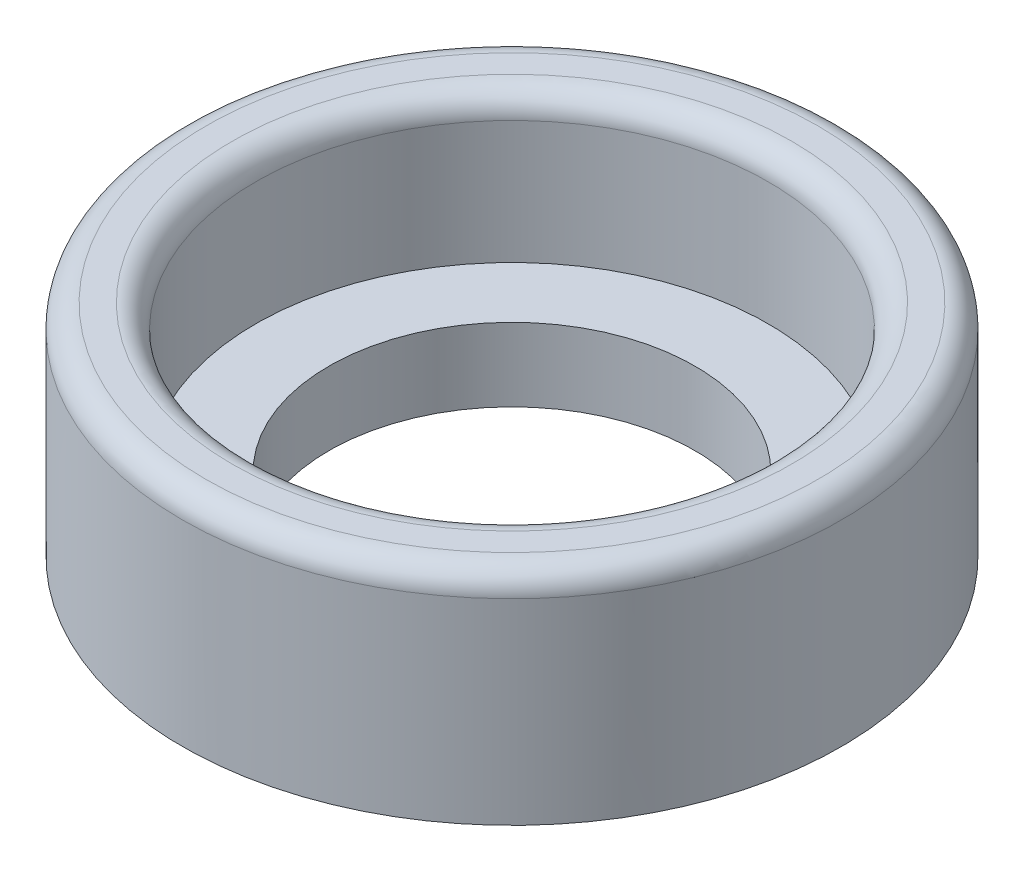
ISO-10303-21;
HEADER;
FILE_DESCRIPTION(('STEP AP214'),'2;1');
FILE_NAME('part.step','',(''),(''),'','','');
FILE_SCHEMA(('AUTOMOTIVE_DESIGN { 1 0 10303 214 1 1 1 1 }'));
ENDSEC;
DATA;
#1=APPLICATION_CONTEXT('core data for automotive mechanical design processes');
#2=APPLICATION_PROTOCOL_DEFINITION('international standard','automotive_design',2000,#1);
#3=PRODUCT_CONTEXT('',#1,'mechanical');
#4=PRODUCT('Part','Part','',(#3));
#5=PRODUCT_RELATED_PRODUCT_CATEGORY('part','',(#4));
#6=PRODUCT_DEFINITION_FORMATION('','',#4);
#7=PRODUCT_DEFINITION_CONTEXT('part definition',#1,'design');
#8=PRODUCT_DEFINITION('design','',#6,#7);
#9=PRODUCT_DEFINITION_SHAPE('','',#8);
#10=(LENGTH_UNIT() NAMED_UNIT(*) SI_UNIT(.MILLI.,.METRE.));
#11=(NAMED_UNIT(*) PLANE_ANGLE_UNIT() SI_UNIT($,.RADIAN.));
#12=(NAMED_UNIT(*) SI_UNIT($,.STERADIAN.) SOLID_ANGLE_UNIT());
#13=UNCERTAINTY_MEASURE_WITH_UNIT(LENGTH_MEASURE(1.E-05),#10,'distance_accuracy_value','');
#14=(GEOMETRIC_REPRESENTATION_CONTEXT(3) GLOBAL_UNCERTAINTY_ASSIGNED_CONTEXT((#13)) GLOBAL_UNIT_ASSIGNED_CONTEXT((#10,
#11,#12)) REPRESENTATION_CONTEXT('',''));
#15=CARTESIAN_POINT('',(0.,0.,0.));
#16=DIRECTION('',(0.,0.,1.));
#17=DIRECTION('',(1.,0.,0.));
#18=AXIS2_PLACEMENT_3D('',#15,#16,#17);
#19=CARTESIAN_POINT('',(0.,4.7625,0.));
#20=DIRECTION('',(0.,-1.,0.));
#21=DIRECTION('',(0.,0.,-1.));
#22=AXIS2_PLACEMENT_3D('',#19,#20,#21);
#23=CYLINDRICAL_SURFACE('',#22,7.14375);
#24=CARTESIAN_POINT('',(0.,4.2545,0.));
#25=DIRECTION('',(0.,1.,0.));
#26=DIRECTION('',(0.,0.,1.));
#27=AXIS2_PLACEMENT_3D('',#24,#25,#26);
#28=CIRCLE('',#27,7.14375);
#29=CARTESIAN_POINT('',(0.,4.2545,-7.14375));
#30=VERTEX_POINT('',#29);
#31=EDGE_CURVE('E48',#30,#30,#28,.F.);
#32=CARTESIAN_POINT('',(0.,0.,0.));
#33=DIRECTION('',(0.,1.,0.));
#34=DIRECTION('',(0.,0.,1.));
#35=AXIS2_PLACEMENT_3D('',#32,#33,#34);
#36=CIRCLE('',#35,7.14375);
#37=CARTESIAN_POINT('',(0.,0.,-7.14375));
#38=VERTEX_POINT('',#37);
#39=EDGE_CURVE('E64',#38,#38,#36,.T.);
#40=CARTESIAN_POINT('',(0.,4.2545,-7.14375));
#41=CARTESIAN_POINT('',(0.,4.21018229166667,-7.14375));
#42=CARTESIAN_POINT('',(0.,4.16586458333333,-7.14375));
#43=CARTESIAN_POINT('',(0.,4.07722916666667,-7.14375));
#44=CARTESIAN_POINT('',(0.,4.03291145833333,-7.14375));
#45=CARTESIAN_POINT('',(0.,3.94427604166667,-7.14375));
#46=CARTESIAN_POINT('',(0.,3.89995833333333,-7.14375));
#47=CARTESIAN_POINT('',(0.,3.81132291666667,-7.14375));
#48=CARTESIAN_POINT('',(0.,3.76700520833333,-7.14375));
#49=CARTESIAN_POINT('',(0.,3.67836979166667,-7.14375));
#50=CARTESIAN_POINT('',(0.,3.63405208333333,-7.14375));
#51=CARTESIAN_POINT('',(0.,3.54541666666667,-7.14375));
#52=CARTESIAN_POINT('',(0.,3.50109895833333,-7.14375));
#53=CARTESIAN_POINT('',(0.,3.41246354166667,-7.14375));
#54=CARTESIAN_POINT('',(0.,3.36814583333333,-7.14375));
#55=CARTESIAN_POINT('',(0.,3.27951041666667,-7.14375));
#56=CARTESIAN_POINT('',(0.,3.23519270833333,-7.14375));
#57=CARTESIAN_POINT('',(0.,3.14655729166667,-7.14375));
#58=CARTESIAN_POINT('',(0.,3.10223958333333,-7.14375));
#59=CARTESIAN_POINT('',(0.,3.01360416666667,-7.14375));
#60=CARTESIAN_POINT('',(0.,2.96928645833333,-7.14375));
#61=CARTESIAN_POINT('',(0.,2.88065104166667,-7.14375));
#62=CARTESIAN_POINT('',(0.,2.83633333333333,-7.14375));
#63=CARTESIAN_POINT('',(0.,2.74769791666667,-7.14375));
#64=CARTESIAN_POINT('',(0.,2.70338020833333,-7.14375));
#65=CARTESIAN_POINT('',(0.,2.61474479166667,-7.14375));
#66=CARTESIAN_POINT('',(0.,2.57042708333333,-7.14375));
#67=CARTESIAN_POINT('',(0.,2.48179166666667,-7.14375));
#68=CARTESIAN_POINT('',(0.,2.43747395833333,-7.14375));
#69=CARTESIAN_POINT('',(0.,2.34883854166667,-7.14375));
#70=CARTESIAN_POINT('',(0.,2.30452083333333,-7.14375));
#71=CARTESIAN_POINT('',(0.,2.21588541666667,-7.14375));
#72=CARTESIAN_POINT('',(0.,2.17156770833333,-7.14375));
#73=CARTESIAN_POINT('',(0.,2.08293229166667,-7.14375));
#74=CARTESIAN_POINT('',(0.,2.03861458333333,-7.14375));
#75=CARTESIAN_POINT('',(0.,1.94997916666667,-7.14375));
#76=CARTESIAN_POINT('',(0.,1.90566145833333,-7.14375));
#77=CARTESIAN_POINT('',(0.,1.81702604166667,-7.14375));
#78=CARTESIAN_POINT('',(0.,1.77270833333333,-7.14375));
#79=CARTESIAN_POINT('',(0.,1.68407291666667,-7.14375));
#80=CARTESIAN_POINT('',(0.,1.63975520833333,-7.14375));
#81=CARTESIAN_POINT('',(0.,1.55111979166667,-7.14375));
#82=CARTESIAN_POINT('',(0.,1.50680208333333,-7.14375));
#83=CARTESIAN_POINT('',(0.,1.41816666666667,-7.14375));
#84=CARTESIAN_POINT('',(0.,1.37384895833333,-7.14375));
#85=CARTESIAN_POINT('',(0.,1.28521354166667,-7.14375));
#86=CARTESIAN_POINT('',(0.,1.24089583333333,-7.14375));
#87=CARTESIAN_POINT('',(0.,1.15226041666667,-7.14375));
#88=CARTESIAN_POINT('',(0.,1.10794270833333,-7.14375));
#89=CARTESIAN_POINT('',(0.,1.01930729166667,-7.14375));
#90=CARTESIAN_POINT('',(0.,0.974989583333333,-7.14375));
#91=CARTESIAN_POINT('',(0.,0.886354166666666,-7.14375));
#92=CARTESIAN_POINT('',(0.,0.842036458333333,-7.14375));
#93=CARTESIAN_POINT('',(0.,0.753401041666666,-7.14375));
#94=CARTESIAN_POINT('',(0.,0.709083333333333,-7.14375));
#95=CARTESIAN_POINT('',(0.,0.620447916666666,-7.14375));
#96=CARTESIAN_POINT('',(0.,0.576130208333333,-7.14375));
#97=CARTESIAN_POINT('',(0.,0.487494791666666,-7.14375));
#98=CARTESIAN_POINT('',(0.,0.443177083333333,-7.14375));
#99=CARTESIAN_POINT('',(0.,0.354541666666666,-7.14375));
#100=CARTESIAN_POINT('',(0.,0.310223958333333,-7.14375));
#101=CARTESIAN_POINT('',(0.,0.221588541666666,-7.14375));
#102=CARTESIAN_POINT('',(0.,0.177270833333333,-7.14375));
#103=CARTESIAN_POINT('',(0.,0.0886354166666665,-7.14375));
#104=CARTESIAN_POINT('',(0.,0.0443177083333333,-7.14375));
#105=CARTESIAN_POINT('',(0.,0.,-7.14375));
#106=B_SPLINE_CURVE_WITH_KNOTS('',3,(#40,#41,#42,#43,#44,#45,#46,#47,#48,#49,#50,#51,#52,#53,
#54,#55,#56,#57,#58,#59,#60,#61,#62,#63,#64,#65,#66,#67,#68,#69,#70,#71,#72,#73,#74,#75,#76,#77,
#78,#79,#80,#81,#82,#83,#84,#85,#86,#87,#88,#89,#90,#91,#92,#93,#94,#95,#96,#97,#98,#99,#100,
#101,#102,#103,#104,#105),.UNSPECIFIED.,.F.,.F.,(4,2,2,2,2,2,2,2,2,2,2,2,2,2,2,2,2,2,2,2,2,2,2,
2,2,2,2,2,2,2,2,2,4),(0.,0.132953125000001,0.265906250000001,0.398859375,0.5318125,0.664765625,
0.797718750000001,0.930671875,1.063625,1.196578125,1.32953125,1.462484375,1.5954375,1.728390625,
1.86134375,1.994296875,2.12725,2.260203125,2.39315625,2.526109375,2.6590625,2.792015625,
2.92496875,3.057921875,3.190875,3.323828125,3.45678125,3.589734375,3.7226875,3.855640625,
3.98859375,4.121546875,4.2545),.UNSPECIFIED.);
#107=EDGE_CURVE('BSEAM40',#30,#38,#106,.T.);
#108=ORIENTED_EDGE('',*,*,#31,.T.);
#109=ORIENTED_EDGE('',*,*,#39,.T.);
#110=ORIENTED_EDGE('',*,*,#107,.T.);
#111=ORIENTED_EDGE('',*,*,#107,.F.);
#112=EDGE_LOOP('',(#108,#110,#109,#111));
#113=FACE_BOUND('',#112,.T.);
#114=ADVANCED_FACE('F40',(#113),#23,.T.);
#115=CARTESIAN_POINT('',(0.,4.7625,0.));
#116=DIRECTION('',(0.,1.,0.));
#117=DIRECTION('',(0.,0.,1.));
#118=AXIS2_PLACEMENT_3D('',#115,#116,#117);
#119=PLANE('',#118);
#120=CARTESIAN_POINT('',(0.,4.7625,0.));
#121=DIRECTION('',(0.,1.,0.));
#122=DIRECTION('',(0.,0.,1.));
#123=AXIS2_PLACEMENT_3D('',#120,#121,#122);
#124=CIRCLE('',#123,6.63575);
#125=CARTESIAN_POINT('',(0.,4.7625,6.63575));
#126=VERTEX_POINT('',#125);
#127=EDGE_CURVE('E53',#126,#126,#124,.T.);
#128=ORIENTED_EDGE('',*,*,#127,.T.);
#129=EDGE_LOOP('',(#128));
#130=FACE_BOUND('',#129,.T.);
#131=CARTESIAN_POINT('',(0.,4.7625,0.));
#132=DIRECTION('',(0.,1.,0.));
#133=DIRECTION('',(0.,0.,1.));
#134=AXIS2_PLACEMENT_3D('',#131,#132,#133);
#135=CIRCLE('',#134,6.06425);
#136=CARTESIAN_POINT('',(0.,4.7625,6.06425));
#137=VERTEX_POINT('',#136);
#138=EDGE_CURVE('E58',#137,#137,#135,.F.);
#139=ORIENTED_EDGE('',*,*,#138,.T.);
#140=EDGE_LOOP('',(#139));
#141=FACE_BOUND('',#140,.T.);
#142=ADVANCED_FACE('F96',(#130,#141),#119,.T.);
#143=CARTESIAN_POINT('',(0.,0.,0.));
#144=DIRECTION('',(0.,1.,0.));
#145=DIRECTION('',(0.,0.,1.));
#146=AXIS2_PLACEMENT_3D('',#143,#144,#145);
#147=PLANE('',#146);
#148=CARTESIAN_POINT('',(0.,0.,0.));
#149=DIRECTION('',(0.,1.,0.));
#150=DIRECTION('',(0.,0.,1.));
#151=AXIS2_PLACEMENT_3D('',#148,#149,#150);
#152=CIRCLE('',#151,3.96875);
#153=CARTESIAN_POINT('',(0.,0.,3.96875));
#154=VERTEX_POINT('',#153);
#155=EDGE_CURVE('E68',#154,#154,#152,.T.);
#156=ORIENTED_EDGE('',*,*,#155,.T.);
#157=EDGE_LOOP('',(#156));
#158=FACE_BOUND('',#157,.T.);
#159=ORIENTED_EDGE('',*,*,#39,.F.);
#160=EDGE_LOOP('',(#159));
#161=FACE_BOUND('',#160,.T.);
#162=ADVANCED_FACE('F101',(#158,#161),#147,.F.);
#163=CARTESIAN_POINT('',(0.,4.7625,0.));
#164=DIRECTION('',(0.,1.,0.));
#165=DIRECTION('',(0.,0.,1.));
#166=AXIS2_PLACEMENT_3D('',#163,#164,#165);
#167=CYLINDRICAL_SURFACE('',#166,3.96875);
#168=ORIENTED_EDGE('',*,*,#155,.F.);
#169=EDGE_LOOP('',(#168));
#170=FACE_BOUND('',#169,.T.);
#171=CARTESIAN_POINT('',(0.,1.5875,0.));
#172=DIRECTION('',(0.,1.,0.));
#173=DIRECTION('',(0.,0.,1.));
#174=AXIS2_PLACEMENT_3D('',#171,#172,#173);
#175=CIRCLE('',#174,3.96875);
#176=CARTESIAN_POINT('',(0.,1.5875,3.96875));
#177=VERTEX_POINT('',#176);
#178=EDGE_CURVE('E72',#177,#177,#175,.T.);
#179=ORIENTED_EDGE('',*,*,#178,.T.);
#180=EDGE_LOOP('',(#179));
#181=FACE_BOUND('',#180,.T.);
#182=ADVANCED_FACE('F92',(#170,#181),#167,.F.);
#183=CARTESIAN_POINT('',(3.96875,1.5875,0.));
#184=DIRECTION('',(0.,-1.,0.));
#185=DIRECTION('',(0.,0.,-1.));
#186=AXIS2_PLACEMENT_3D('',#183,#184,#185);
#187=PLANE('',#186);
#188=ORIENTED_EDGE('',*,*,#178,.F.);
#189=EDGE_LOOP('',(#188));
#190=FACE_BOUND('',#189,.T.);
#191=CARTESIAN_POINT('',(0.,1.5875,0.));
#192=DIRECTION('',(0.,1.,0.));
#193=DIRECTION('',(0.,0.,1.));
#194=AXIS2_PLACEMENT_3D('',#191,#192,#193);
#195=CIRCLE('',#194,5.55625);
#196=CARTESIAN_POINT('',(0.,1.5875,5.55625));
#197=VERTEX_POINT('',#196);
#198=EDGE_CURVE('E76',#197,#197,#195,.T.);
#199=ORIENTED_EDGE('',*,*,#198,.T.);
#200=EDGE_LOOP('',(#199));
#201=FACE_BOUND('',#200,.T.);
#202=ADVANCED_FACE('F81',(#190,#201),#187,.F.);
#203=CARTESIAN_POINT('',(0.,4.7625,0.));
#204=DIRECTION('',(0.,1.,0.));
#205=DIRECTION('',(0.,0.,1.));
#206=AXIS2_PLACEMENT_3D('',#203,#204,#205);
#207=CYLINDRICAL_SURFACE('',#206,5.55625);
#208=CARTESIAN_POINT('',(0.,4.2545,0.));
#209=DIRECTION('',(0.,1.,0.));
#210=DIRECTION('',(0.,0.,1.));
#211=AXIS2_PLACEMENT_3D('',#208,#209,#210);
#212=CIRCLE('',#211,5.55625);
#213=CARTESIAN_POINT('',(0.,4.2545,5.55625));
#214=VERTEX_POINT('',#213);
#215=EDGE_CURVE('E10',#214,#214,#212,.T.);
#216=ORIENTED_EDGE('',*,*,#215,.T.);
#217=EDGE_LOOP('',(#216));
#218=FACE_BOUND('',#217,.T.);
#219=ORIENTED_EDGE('',*,*,#198,.F.);
#220=EDGE_LOOP('',(#219));
#221=FACE_BOUND('',#220,.T.);
#222=ADVANCED_FACE('F83',(#218,#221),#207,.F.);
#223=CARTESIAN_POINT('',(0.,4.2545,0.));
#224=DIRECTION('',(0.,1.,0.));
#225=DIRECTION('',(0.,0.,1.));
#226=AXIS2_PLACEMENT_3D('',#223,#224,#225);
#227=TOROIDAL_SURFACE('',#226,6.63575,0.508);
#228=ORIENTED_EDGE('',*,*,#31,.F.);
#229=EDGE_LOOP('',(#228));
#230=FACE_BOUND('',#229,.T.);
#231=ORIENTED_EDGE('',*,*,#127,.F.);
#232=EDGE_LOOP('',(#231));
#233=FACE_BOUND('',#232,.T.);
#234=ADVANCED_FACE('F85',(#230,#233),#227,.T.);
#235=CARTESIAN_POINT('',(0.,4.2545,0.));
#236=DIRECTION('',(0.,1.,0.));
#237=DIRECTION('',(0.,0.,1.));
#238=AXIS2_PLACEMENT_3D('',#235,#236,#237);
#239=TOROIDAL_SURFACE('',#238,6.06425,0.508);
#240=ORIENTED_EDGE('',*,*,#138,.F.);
#241=EDGE_LOOP('',(#240));
#242=FACE_BOUND('',#241,.T.);
#243=ORIENTED_EDGE('',*,*,#215,.F.);
#244=EDGE_LOOP('',(#243));
#245=FACE_BOUND('',#244,.T.);
#246=ADVANCED_FACE('F42',(#242,#245),#239,.T.);
#247=CLOSED_SHELL('',(#114,#142,#162,#182,#202,#222,#234,#246));
#248=MANIFOLD_SOLID_BREP('B2',#247);
#249=ADVANCED_BREP_SHAPE_REPRESENTATION('',(#18,#248),#14);
#250=SHAPE_DEFINITION_REPRESENTATION(#9,#249);
ENDSEC;
END-ISO-10303-21;
